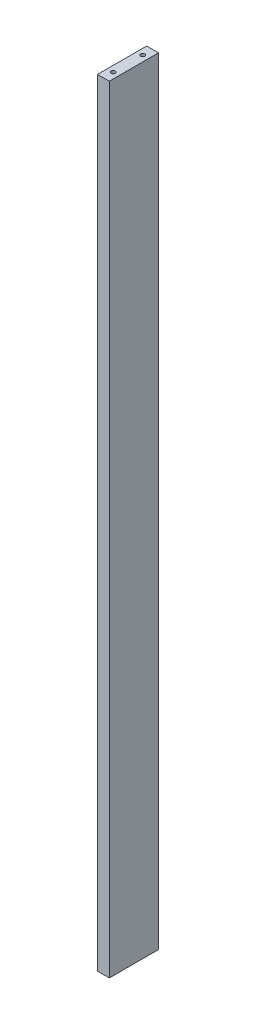
ISO-10303-21;
HEADER;
FILE_DESCRIPTION(('STEP AP214'),'2;1');
FILE_NAME('part.step','',(''),(''),'','','');
FILE_SCHEMA(('AUTOMOTIVE_DESIGN { 1 0 10303 214 1 1 1 1 }'));
ENDSEC;
DATA;
#1=APPLICATION_CONTEXT('core data for automotive mechanical design processes');
#2=APPLICATION_PROTOCOL_DEFINITION('international standard','automotive_design',2000,#1);
#3=PRODUCT_CONTEXT('',#1,'mechanical');
#4=PRODUCT('Part','Part','',(#3));
#5=PRODUCT_RELATED_PRODUCT_CATEGORY('part','',(#4));
#6=PRODUCT_DEFINITION_FORMATION('','',#4);
#7=PRODUCT_DEFINITION_CONTEXT('part definition',#1,'design');
#8=PRODUCT_DEFINITION('design','',#6,#7);
#9=PRODUCT_DEFINITION_SHAPE('','',#8);
#10=(LENGTH_UNIT() NAMED_UNIT(*) SI_UNIT(.MILLI.,.METRE.));
#11=(NAMED_UNIT(*) PLANE_ANGLE_UNIT() SI_UNIT($,.RADIAN.));
#12=(NAMED_UNIT(*) SI_UNIT($,.STERADIAN.) SOLID_ANGLE_UNIT());
#13=UNCERTAINTY_MEASURE_WITH_UNIT(LENGTH_MEASURE(1.E-05),#10,'distance_accuracy_value','');
#14=(GEOMETRIC_REPRESENTATION_CONTEXT(3) GLOBAL_UNCERTAINTY_ASSIGNED_CONTEXT((#13)) GLOBAL_UNIT_ASSIGNED_CONTEXT((#10,
#11,#12)) REPRESENTATION_CONTEXT('',''));
#15=CARTESIAN_POINT('',(0.,0.,0.));
#16=DIRECTION('',(0.,0.,1.));
#17=DIRECTION('',(1.,0.,0.));
#18=AXIS2_PLACEMENT_3D('',#15,#16,#17);
#19=CARTESIAN_POINT('',(0.,789.8,0.));
#20=DIRECTION('',(1.,0.,0.));
#21=DIRECTION('',(0.,0.,-1.));
#22=AXIS2_PLACEMENT_3D('',#19,#20,#21);
#23=PLANE('',#22);
#24=DIRECTION('',(0.,0.,1.));
#25=VECTOR('',#24,1.);
#26=CARTESIAN_POINT('',(0.,0.,0.));
#27=LINE('',#26,#25);
#28=CARTESIAN_POINT('',(0.,0.,-50.));
#29=VERTEX_POINT('',#28);
#30=CARTESIAN_POINT('',(0.,0.,0.));
#31=VERTEX_POINT('',#30);
#32=EDGE_CURVE('E128',#29,#31,#27,.T.);
#33=ORIENTED_EDGE('',*,*,#32,.T.);
#34=DIRECTION('',(0.,-1.,0.));
#35=VECTOR('',#34,1.);
#36=CARTESIAN_POINT('',(0.,789.8,0.));
#37=LINE('',#36,#35);
#38=CARTESIAN_POINT('',(0.,789.8,0.));
#39=VERTEX_POINT('',#38);
#40=EDGE_CURVE('E11',#39,#31,#37,.T.);
#41=ORIENTED_EDGE('',*,*,#40,.F.);
#42=DIRECTION('',(0.,0.,1.));
#43=VECTOR('',#42,1.);
#44=CARTESIAN_POINT('',(0.,789.8,0.));
#45=LINE('',#44,#43);
#46=CARTESIAN_POINT('',(0.,789.8,-50.));
#47=VERTEX_POINT('',#46);
#48=EDGE_CURVE('E129',#47,#39,#45,.T.);
#49=ORIENTED_EDGE('',*,*,#48,.F.);
#50=DIRECTION('',(0.,-1.,0.));
#51=VECTOR('',#50,1.);
#52=CARTESIAN_POINT('',(0.,789.8,-50.));
#53=LINE('',#52,#51);
#54=EDGE_CURVE('E135',#47,#29,#53,.T.);
#55=ORIENTED_EDGE('',*,*,#54,.T.);
#56=EDGE_LOOP('',(#33,#41,#49,#55));
#57=FACE_BOUND('',#56,.T.);
#58=ADVANCED_FACE('F35',(#57),#23,.F.);
#59=CARTESIAN_POINT('',(0.,789.8,0.));
#60=DIRECTION('',(0.,0.,-1.));
#61=DIRECTION('',(-1.,0.,0.));
#62=AXIS2_PLACEMENT_3D('',#59,#60,#61);
#63=PLANE('',#62);
#64=DIRECTION('',(1.,0.,0.));
#65=VECTOR('',#64,1.);
#66=CARTESIAN_POINT('',(0.,0.,0.));
#67=LINE('',#66,#65);
#68=CARTESIAN_POINT('',(12.,0.,0.));
#69=VERTEX_POINT('',#68);
#70=EDGE_CURVE('E138',#31,#69,#67,.T.);
#71=ORIENTED_EDGE('',*,*,#70,.T.);
#72=DIRECTION('',(0.,-1.,0.));
#73=VECTOR('',#72,1.);
#74=CARTESIAN_POINT('',(12.,789.8,0.));
#75=LINE('',#74,#73);
#76=CARTESIAN_POINT('',(12.,789.8,0.));
#77=VERTEX_POINT('',#76);
#78=EDGE_CURVE('E43',#77,#69,#75,.T.);
#79=ORIENTED_EDGE('',*,*,#78,.F.);
#80=DIRECTION('',(1.,0.,0.));
#81=VECTOR('',#80,1.);
#82=CARTESIAN_POINT('',(0.,789.8,0.));
#83=LINE('',#82,#81);
#84=EDGE_CURVE('E82',#39,#77,#83,.T.);
#85=ORIENTED_EDGE('',*,*,#84,.F.);
#86=ORIENTED_EDGE('',*,*,#40,.T.);
#87=EDGE_LOOP('',(#71,#79,#85,#86));
#88=FACE_BOUND('',#87,.T.);
#89=ADVANCED_FACE('F163',(#88),#63,.F.);
#90=CARTESIAN_POINT('',(12.,789.8,0.));
#91=DIRECTION('',(-1.,0.,0.));
#92=DIRECTION('',(0.,0.,1.));
#93=AXIS2_PLACEMENT_3D('',#90,#91,#92);
#94=PLANE('',#93);
#95=DIRECTION('',(0.,0.,-1.));
#96=VECTOR('',#95,1.);
#97=CARTESIAN_POINT('',(12.,0.,0.));
#98=LINE('',#97,#96);
#99=CARTESIAN_POINT('',(12.,0.,-50.));
#100=VERTEX_POINT('',#99);
#101=EDGE_CURVE('E69',#69,#100,#98,.T.);
#102=ORIENTED_EDGE('',*,*,#101,.T.);
#103=DIRECTION('',(0.,-1.,0.));
#104=VECTOR('',#103,1.);
#105=CARTESIAN_POINT('',(12.,789.8,-50.));
#106=LINE('',#105,#104);
#107=CARTESIAN_POINT('',(12.,789.8,-50.));
#108=VERTEX_POINT('',#107);
#109=EDGE_CURVE('E143',#108,#100,#106,.T.);
#110=ORIENTED_EDGE('',*,*,#109,.F.);
#111=DIRECTION('',(0.,0.,-1.));
#112=VECTOR('',#111,1.);
#113=CARTESIAN_POINT('',(12.,789.8,0.));
#114=LINE('',#113,#112);
#115=EDGE_CURVE('E132',#77,#108,#114,.T.);
#116=ORIENTED_EDGE('',*,*,#115,.F.);
#117=ORIENTED_EDGE('',*,*,#78,.T.);
#118=EDGE_LOOP('',(#102,#110,#116,#117));
#119=FACE_BOUND('',#118,.T.);
#120=ADVANCED_FACE('F145',(#119),#94,.F.);
#121=CARTESIAN_POINT('',(0.,789.8,-50.));
#122=DIRECTION('',(0.,0.,1.));
#123=DIRECTION('',(1.,0.,0.));
#124=AXIS2_PLACEMENT_3D('',#121,#122,#123);
#125=PLANE('',#124);
#126=DIRECTION('',(-1.,0.,0.));
#127=VECTOR('',#126,1.);
#128=CARTESIAN_POINT('',(0.,0.,-50.));
#129=LINE('',#128,#127);
#130=EDGE_CURVE('E75',#100,#29,#129,.T.);
#131=ORIENTED_EDGE('',*,*,#130,.T.);
#132=ORIENTED_EDGE('',*,*,#54,.F.);
#133=DIRECTION('',(-1.,0.,0.));
#134=VECTOR('',#133,1.);
#135=CARTESIAN_POINT('',(0.,789.8,-50.));
#136=LINE('',#135,#134);
#137=EDGE_CURVE('E51',#108,#47,#136,.T.);
#138=ORIENTED_EDGE('',*,*,#137,.F.);
#139=ORIENTED_EDGE('',*,*,#109,.T.);
#140=EDGE_LOOP('',(#131,#132,#138,#139));
#141=FACE_BOUND('',#140,.T.);
#142=ADVANCED_FACE('F152',(#141),#125,.F.);
#143=CARTESIAN_POINT('',(0.,789.8,0.));
#144=DIRECTION('',(0.,-1.,0.));
#145=DIRECTION('',(0.,0.,-1.));
#146=AXIS2_PLACEMENT_3D('',#143,#144,#145);
#147=PLANE('',#146);
#148=CARTESIAN_POINT('',(6.,789.8,-40.));
#149=DIRECTION('',(0.,1.,0.));
#150=DIRECTION('',(0.,0.,1.));
#151=AXIS2_PLACEMENT_3D('',#148,#149,#150);
#152=CIRCLE('',#151,2.09999999999999);
#153=CARTESIAN_POINT('',(6.,789.8,-37.9));
#154=VERTEX_POINT('',#153);
#155=EDGE_CURVE('E106',#154,#154,#152,.T.);
#156=ORIENTED_EDGE('',*,*,#155,.F.);
#157=EDGE_LOOP('',(#156));
#158=FACE_BOUND('',#157,.T.);
#159=CARTESIAN_POINT('',(6.,789.8,-10.));
#160=DIRECTION('',(0.,1.,0.));
#161=DIRECTION('',(0.,0.,1.));
#162=AXIS2_PLACEMENT_3D('',#159,#160,#161);
#163=CIRCLE('',#162,2.09999999999999);
#164=CARTESIAN_POINT('',(6.,789.8,-7.90000000000001));
#165=VERTEX_POINT('',#164);
#166=EDGE_CURVE('E105',#165,#165,#163,.T.);
#167=ORIENTED_EDGE('',*,*,#166,.F.);
#168=EDGE_LOOP('',(#167));
#169=FACE_BOUND('',#168,.T.);
#170=ORIENTED_EDGE('',*,*,#48,.T.);
#171=ORIENTED_EDGE('',*,*,#84,.T.);
#172=ORIENTED_EDGE('',*,*,#115,.T.);
#173=ORIENTED_EDGE('',*,*,#137,.T.);
#174=EDGE_LOOP('',(#170,#171,#172,#173));
#175=FACE_BOUND('',#174,.T.);
#176=ADVANCED_FACE('F154',(#158,#169,#175),#147,.F.);
#177=CARTESIAN_POINT('',(0.,0.,0.));
#178=DIRECTION('',(0.,-1.,0.));
#179=DIRECTION('',(0.,0.,-1.));
#180=AXIS2_PLACEMENT_3D('',#177,#178,#179);
#181=PLANE('',#180);
#182=CARTESIAN_POINT('',(6.,0.,-40.));
#183=DIRECTION('',(0.,-1.,0.));
#184=DIRECTION('',(0.,0.,-1.));
#185=AXIS2_PLACEMENT_3D('',#182,#183,#184);
#186=CIRCLE('',#185,2.09999999999999);
#187=CARTESIAN_POINT('',(6.,0.,-42.1));
#188=VERTEX_POINT('',#187);
#189=EDGE_CURVE('E116',#188,#188,#186,.T.);
#190=ORIENTED_EDGE('',*,*,#189,.F.);
#191=EDGE_LOOP('',(#190));
#192=FACE_BOUND('',#191,.T.);
#193=CARTESIAN_POINT('',(6.,0.,-10.));
#194=DIRECTION('',(0.,-1.,0.));
#195=DIRECTION('',(0.,0.,-1.));
#196=AXIS2_PLACEMENT_3D('',#193,#194,#195);
#197=CIRCLE('',#196,2.09999999999999);
#198=CARTESIAN_POINT('',(6.,0.,-12.1));
#199=VERTEX_POINT('',#198);
#200=EDGE_CURVE('E122',#199,#199,#197,.T.);
#201=ORIENTED_EDGE('',*,*,#200,.F.);
#202=EDGE_LOOP('',(#201));
#203=FACE_BOUND('',#202,.T.);
#204=ORIENTED_EDGE('',*,*,#32,.F.);
#205=ORIENTED_EDGE('',*,*,#130,.F.);
#206=ORIENTED_EDGE('',*,*,#101,.F.);
#207=ORIENTED_EDGE('',*,*,#70,.F.);
#208=EDGE_LOOP('',(#204,#205,#206,#207));
#209=FACE_BOUND('',#208,.T.);
#210=ADVANCED_FACE('F148',(#192,#203,#209),#181,.T.);
#211=CARTESIAN_POINT('',(6.,14.,-10.));
#212=DIRECTION('',(0.,-1.,0.));
#213=DIRECTION('',(0.,0.,-1.));
#214=AXIS2_PLACEMENT_3D('',#211,#212,#213);
#215=CONICAL_SURFACE('',#214,2.09999999999999,1.02974425867665);
#216=CARTESIAN_POINT('',(5.99999999999999,15.2618072999579,-10.));
#217=VERTEX_POINT('',#216);
#218=VERTEX_LOOP('',#217);
#219=FACE_BOUND('',#218,.T.);
#220=CARTESIAN_POINT('',(6.,14.,-10.));
#221=DIRECTION('',(0.,-1.,0.));
#222=DIRECTION('',(0.,0.,-1.));
#223=AXIS2_PLACEMENT_3D('',#220,#221,#222);
#224=CIRCLE('',#223,2.09999999999999);
#225=CARTESIAN_POINT('',(6.,14.,-12.1));
#226=VERTEX_POINT('',#225);
#227=EDGE_CURVE('E125',#226,#226,#224,.T.);
#228=ORIENTED_EDGE('',*,*,#227,.T.);
#229=EDGE_LOOP('',(#228));
#230=FACE_BOUND('',#229,.T.);
#231=ADVANCED_FACE('F189',(#219,#230),#215,.F.);
#232=CARTESIAN_POINT('',(6.,0.,-10.));
#233=DIRECTION('',(0.,-1.,0.));
#234=DIRECTION('',(0.,0.,-1.));
#235=AXIS2_PLACEMENT_3D('',#232,#233,#234);
#236=CYLINDRICAL_SURFACE('',#235,2.09999999999999);
#237=ORIENTED_EDGE('',*,*,#227,.F.);
#238=EDGE_LOOP('',(#237));
#239=FACE_BOUND('',#238,.T.);
#240=ORIENTED_EDGE('',*,*,#200,.T.);
#241=EDGE_LOOP('',(#240));
#242=FACE_BOUND('',#241,.T.);
#243=ADVANCED_FACE('F197',(#239,#242),#236,.F.);
#244=CARTESIAN_POINT('',(6.,14.,-40.));
#245=DIRECTION('',(0.,-1.,0.));
#246=DIRECTION('',(0.,0.,-1.));
#247=AXIS2_PLACEMENT_3D('',#244,#245,#246);
#248=CONICAL_SURFACE('',#247,2.09999999999999,1.02974425867665);
#249=CARTESIAN_POINT('',(6.,15.2618072999579,-40.));
#250=VERTEX_POINT('',#249);
#251=VERTEX_LOOP('',#250);
#252=FACE_BOUND('',#251,.T.);
#253=CARTESIAN_POINT('',(6.,14.,-40.));
#254=DIRECTION('',(0.,-1.,0.));
#255=DIRECTION('',(0.,0.,-1.));
#256=AXIS2_PLACEMENT_3D('',#253,#254,#255);
#257=CIRCLE('',#256,2.09999999999999);
#258=CARTESIAN_POINT('',(6.,14.,-42.1));
#259=VERTEX_POINT('',#258);
#260=EDGE_CURVE('E119',#259,#259,#257,.T.);
#261=ORIENTED_EDGE('',*,*,#260,.T.);
#262=EDGE_LOOP('',(#261));
#263=FACE_BOUND('',#262,.T.);
#264=ADVANCED_FACE('F208',(#252,#263),#248,.F.);
#265=CARTESIAN_POINT('',(6.,0.,-40.));
#266=DIRECTION('',(0.,-1.,0.));
#267=DIRECTION('',(0.,0.,-1.));
#268=AXIS2_PLACEMENT_3D('',#265,#266,#267);
#269=CYLINDRICAL_SURFACE('',#268,2.09999999999999);
#270=ORIENTED_EDGE('',*,*,#260,.F.);
#271=EDGE_LOOP('',(#270));
#272=FACE_BOUND('',#271,.T.);
#273=ORIENTED_EDGE('',*,*,#189,.T.);
#274=EDGE_LOOP('',(#273));
#275=FACE_BOUND('',#274,.T.);
#276=ADVANCED_FACE('F220',(#272,#275),#269,.F.);
#277=CARTESIAN_POINT('',(6.,775.8,-10.));
#278=DIRECTION('',(0.,1.,0.));
#279=DIRECTION('',(0.,0.,1.));
#280=AXIS2_PLACEMENT_3D('',#277,#278,#279);
#281=CONICAL_SURFACE('',#280,2.09999999999999,1.02974425867666);
#282=CARTESIAN_POINT('',(5.99999999999999,774.538192700042,-10.));
#283=VERTEX_POINT('',#282);
#284=VERTEX_LOOP('',#283);
#285=FACE_BOUND('',#284,.T.);
#286=CARTESIAN_POINT('',(6.,775.8,-10.));
#287=DIRECTION('',(0.,1.,0.));
#288=DIRECTION('',(0.,0.,1.));
#289=AXIS2_PLACEMENT_3D('',#286,#287,#288);
#290=CIRCLE('',#289,2.09999999999999);
#291=CARTESIAN_POINT('',(6.,775.8,-7.90000000000001));
#292=VERTEX_POINT('',#291);
#293=EDGE_CURVE('E109',#292,#292,#290,.T.);
#294=ORIENTED_EDGE('',*,*,#293,.T.);
#295=EDGE_LOOP('',(#294));
#296=FACE_BOUND('',#295,.T.);
#297=ADVANCED_FACE('F229',(#285,#296),#281,.F.);
#298=CARTESIAN_POINT('',(6.,789.8,-10.));
#299=DIRECTION('',(0.,1.,0.));
#300=DIRECTION('',(0.,0.,1.));
#301=AXIS2_PLACEMENT_3D('',#298,#299,#300);
#302=CYLINDRICAL_SURFACE('',#301,2.09999999999999);
#303=ORIENTED_EDGE('',*,*,#293,.F.);
#304=EDGE_LOOP('',(#303));
#305=FACE_BOUND('',#304,.T.);
#306=ORIENTED_EDGE('',*,*,#166,.T.);
#307=EDGE_LOOP('',(#306));
#308=FACE_BOUND('',#307,.T.);
#309=ADVANCED_FACE('F99',(#305,#308),#302,.F.);
#310=CARTESIAN_POINT('',(6.,775.8,-40.));
#311=DIRECTION('',(0.,1.,0.));
#312=DIRECTION('',(0.,0.,1.));
#313=AXIS2_PLACEMENT_3D('',#310,#311,#312);
#314=CONICAL_SURFACE('',#313,2.09999999999999,1.02974425867666);
#315=CARTESIAN_POINT('',(6.,774.538192700042,-40.));
#316=VERTEX_POINT('',#315);
#317=VERTEX_LOOP('',#316);
#318=FACE_BOUND('',#317,.T.);
#319=CARTESIAN_POINT('',(6.,775.8,-40.));
#320=DIRECTION('',(0.,1.,0.));
#321=DIRECTION('',(0.,0.,1.));
#322=AXIS2_PLACEMENT_3D('',#319,#320,#321);
#323=CIRCLE('',#322,2.09999999999999);
#324=CARTESIAN_POINT('',(6.,775.8,-37.9));
#325=VERTEX_POINT('',#324);
#326=EDGE_CURVE('E103',#325,#325,#323,.T.);
#327=ORIENTED_EDGE('',*,*,#326,.T.);
#328=EDGE_LOOP('',(#327));
#329=FACE_BOUND('',#328,.T.);
#330=ADVANCED_FACE('F95',(#318,#329),#314,.F.);
#331=CARTESIAN_POINT('',(6.,789.8,-40.));
#332=DIRECTION('',(0.,1.,0.));
#333=DIRECTION('',(0.,0.,1.));
#334=AXIS2_PLACEMENT_3D('',#331,#332,#333);
#335=CYLINDRICAL_SURFACE('',#334,2.09999999999999);
#336=ORIENTED_EDGE('',*,*,#326,.F.);
#337=EDGE_LOOP('',(#336));
#338=FACE_BOUND('',#337,.T.);
#339=ORIENTED_EDGE('',*,*,#155,.T.);
#340=EDGE_LOOP('',(#339));
#341=FACE_BOUND('',#340,.T.);
#342=ADVANCED_FACE('F98',(#338,#341),#335,.F.);
#343=CLOSED_SHELL('',(#58,#89,#120,#142,#176,#210,#231,#243,#264,#276,#297,#309,#330,#342));
#344=MANIFOLD_SOLID_BREP('B2',#343);
#345=ADVANCED_BREP_SHAPE_REPRESENTATION('',(#18,#344),#14);
#346=SHAPE_DEFINITION_REPRESENTATION(#9,#345);
ENDSEC;
END-ISO-10303-21;
